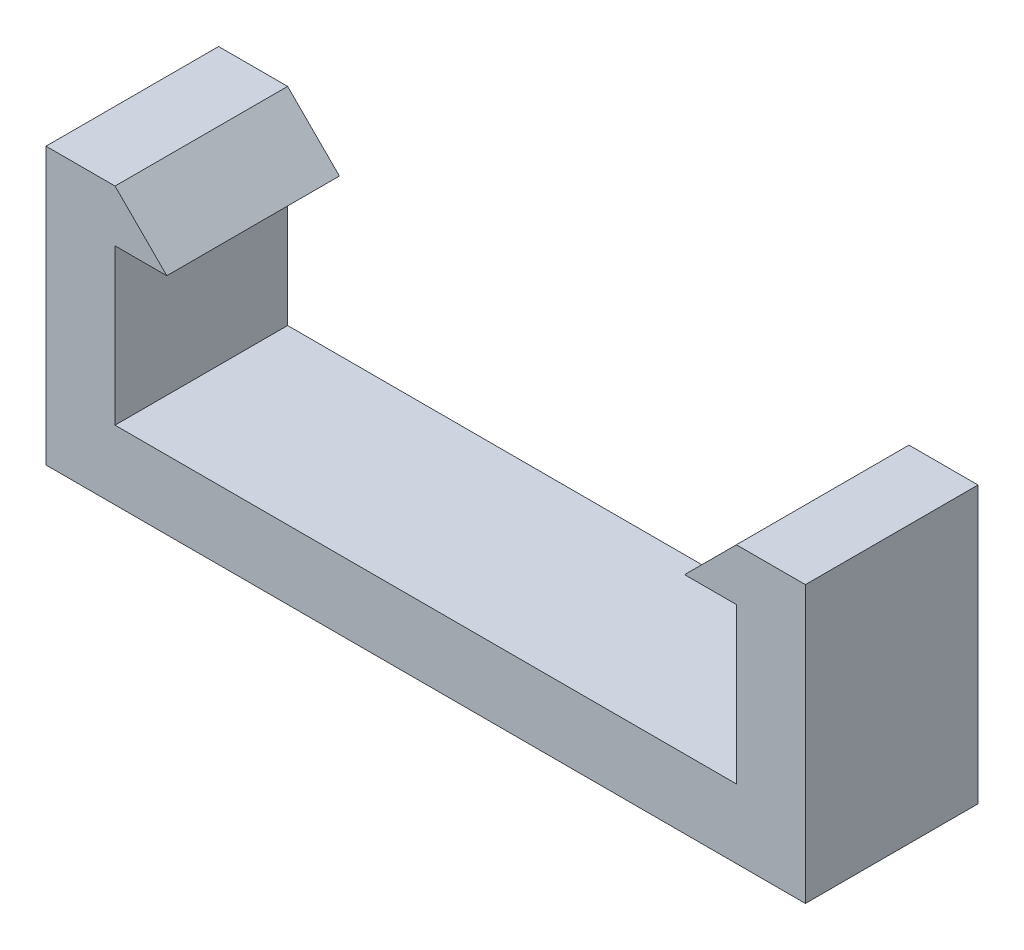
ISO-10303-21;
HEADER;
FILE_DESCRIPTION(('STEP AP214'),'2;1');
FILE_NAME('part.step','',(''),(''),'','','');
FILE_SCHEMA(('AUTOMOTIVE_DESIGN { 1 0 10303 214 1 1 1 1 }'));
ENDSEC;
DATA;
#1=APPLICATION_CONTEXT('core data for automotive mechanical design processes');
#2=APPLICATION_PROTOCOL_DEFINITION('international standard','automotive_design',2000,#1);
#3=PRODUCT_CONTEXT('',#1,'mechanical');
#4=PRODUCT('Part','Part','',(#3));
#5=PRODUCT_RELATED_PRODUCT_CATEGORY('part','',(#4));
#6=PRODUCT_DEFINITION_FORMATION('','',#4);
#7=PRODUCT_DEFINITION_CONTEXT('part definition',#1,'design');
#8=PRODUCT_DEFINITION('design','',#6,#7);
#9=PRODUCT_DEFINITION_SHAPE('','',#8);
#10=(LENGTH_UNIT() NAMED_UNIT(*) SI_UNIT(.MILLI.,.METRE.));
#11=(NAMED_UNIT(*) PLANE_ANGLE_UNIT() SI_UNIT($,.RADIAN.));
#12=(NAMED_UNIT(*) SI_UNIT($,.STERADIAN.) SOLID_ANGLE_UNIT());
#13=UNCERTAINTY_MEASURE_WITH_UNIT(LENGTH_MEASURE(1.E-05),#10,'distance_accuracy_value','');
#14=(GEOMETRIC_REPRESENTATION_CONTEXT(3) GLOBAL_UNCERTAINTY_ASSIGNED_CONTEXT((#13)) GLOBAL_UNIT_ASSIGNED_CONTEXT((#10,
#11,#12)) REPRESENTATION_CONTEXT('',''));
#15=CARTESIAN_POINT('',(0.,0.,0.));
#16=DIRECTION('',(0.,0.,1.));
#17=DIRECTION('',(1.,0.,0.));
#18=AXIS2_PLACEMENT_3D('',#15,#16,#17);
#19=CARTESIAN_POINT('',(2.,0.,5.));
#20=DIRECTION('',(0.,-1.,0.));
#21=DIRECTION('',(1.,0.,0.));
#22=AXIS2_PLACEMENT_3D('',#19,#20,#21);
#23=PLANE('',#22);
#24=DIRECTION('',(-1.,0.,0.));
#25=VECTOR('',#24,1.);
#26=CARTESIAN_POINT('',(2.,0.,0.));
#27=LINE('',#26,#25);
#28=CARTESIAN_POINT('',(2.,0.,0.));
#29=VERTEX_POINT('',#28);
#30=CARTESIAN_POINT('',(0.,0.,0.));
#31=VERTEX_POINT('',#30);
#32=EDGE_CURVE('E153',#29,#31,#27,.T.);
#33=ORIENTED_EDGE('',*,*,#32,.T.);
#34=DIRECTION('',(0.,0.,-1.));
#35=VECTOR('',#34,1.);
#36=CARTESIAN_POINT('',(0.,0.,5.));
#37=LINE('',#36,#35);
#38=CARTESIAN_POINT('',(0.,0.,5.));
#39=VERTEX_POINT('',#38);
#40=EDGE_CURVE('E11',#39,#31,#37,.T.);
#41=ORIENTED_EDGE('',*,*,#40,.F.);
#42=DIRECTION('',(-1.,0.,0.));
#43=VECTOR('',#42,1.);
#44=CARTESIAN_POINT('',(2.,0.,5.));
#45=LINE('',#44,#43);
#46=CARTESIAN_POINT('',(2.,0.,5.));
#47=VERTEX_POINT('',#46);
#48=EDGE_CURVE('E175',#47,#39,#45,.T.);
#49=ORIENTED_EDGE('',*,*,#48,.F.);
#50=DIRECTION('',(0.,0.,-1.));
#51=VECTOR('',#50,1.);
#52=CARTESIAN_POINT('',(2.,0.,5.));
#53=LINE('',#52,#51);
#54=EDGE_CURVE('E149',#47,#29,#53,.T.);
#55=ORIENTED_EDGE('',*,*,#54,.T.);
#56=EDGE_LOOP('',(#33,#41,#49,#55));
#57=FACE_BOUND('',#56,.T.);
#58=ADVANCED_FACE('F33',(#57),#23,.F.);
#59=CARTESIAN_POINT('',(0.,0.,5.));
#60=DIRECTION('',(1.,0.,0.));
#61=DIRECTION('',(0.,1.,0.));
#62=AXIS2_PLACEMENT_3D('',#59,#60,#61);
#63=PLANE('',#62);
#64=DIRECTION('',(0.,-1.,0.));
#65=VECTOR('',#64,1.);
#66=CARTESIAN_POINT('',(0.,0.,0.));
#67=LINE('',#66,#65);
#68=CARTESIAN_POINT('',(0.,-8.,0.));
#69=VERTEX_POINT('',#68);
#70=EDGE_CURVE('E156',#31,#69,#67,.T.);
#71=ORIENTED_EDGE('',*,*,#70,.T.);
#72=DIRECTION('',(0.,0.,-1.));
#73=VECTOR('',#72,1.);
#74=CARTESIAN_POINT('',(0.,-8.,5.));
#75=LINE('',#74,#73);
#76=CARTESIAN_POINT('',(0.,-8.,5.));
#77=VERTEX_POINT('',#76);
#78=EDGE_CURVE('E41',#77,#69,#75,.T.);
#79=ORIENTED_EDGE('',*,*,#78,.F.);
#80=DIRECTION('',(0.,-1.,0.));
#81=VECTOR('',#80,1.);
#82=CARTESIAN_POINT('',(0.,0.,5.));
#83=LINE('',#82,#81);
#84=EDGE_CURVE('E104',#39,#77,#83,.T.);
#85=ORIENTED_EDGE('',*,*,#84,.F.);
#86=ORIENTED_EDGE('',*,*,#40,.T.);
#87=EDGE_LOOP('',(#71,#79,#85,#86));
#88=FACE_BOUND('',#87,.T.);
#89=ADVANCED_FACE('F253',(#88),#63,.F.);
#90=CARTESIAN_POINT('',(0.,-8.,5.));
#91=DIRECTION('',(0.,1.,0.));
#92=DIRECTION('',(0.,0.,1.));
#93=AXIS2_PLACEMENT_3D('',#90,#91,#92);
#94=PLANE('',#93);
#95=DIRECTION('',(1.,0.,0.));
#96=VECTOR('',#95,1.);
#97=CARTESIAN_POINT('',(0.,-8.,0.));
#98=LINE('',#97,#96);
#99=CARTESIAN_POINT('',(22.,-8.,0.));
#100=VERTEX_POINT('',#99);
#101=EDGE_CURVE('E158',#69,#100,#98,.T.);
#102=ORIENTED_EDGE('',*,*,#101,.T.);
#103=DIRECTION('',(0.,0.,-1.));
#104=VECTOR('',#103,1.);
#105=CARTESIAN_POINT('',(22.,-8.,5.));
#106=LINE('',#105,#104);
#107=CARTESIAN_POINT('',(22.,-8.,5.));
#108=VERTEX_POINT('',#107);
#109=EDGE_CURVE('E194',#108,#100,#106,.T.);
#110=ORIENTED_EDGE('',*,*,#109,.F.);
#111=DIRECTION('',(1.,0.,0.));
#112=VECTOR('',#111,1.);
#113=CARTESIAN_POINT('',(0.,-8.,5.));
#114=LINE('',#113,#112);
#115=EDGE_CURVE('E202',#77,#108,#114,.T.);
#116=ORIENTED_EDGE('',*,*,#115,.F.);
#117=ORIENTED_EDGE('',*,*,#78,.T.);
#118=EDGE_LOOP('',(#102,#110,#116,#117));
#119=FACE_BOUND('',#118,.T.);
#120=ADVANCED_FACE('F200',(#119),#94,.F.);
#121=CARTESIAN_POINT('',(22.,-8.,5.));
#122=DIRECTION('',(-1.,0.,0.));
#123=DIRECTION('',(0.,-1.,0.));
#124=AXIS2_PLACEMENT_3D('',#121,#122,#123);
#125=PLANE('',#124);
#126=DIRECTION('',(0.,1.,0.));
#127=VECTOR('',#126,1.);
#128=CARTESIAN_POINT('',(22.,-8.,0.));
#129=LINE('',#128,#127);
#130=CARTESIAN_POINT('',(22.,0.,0.));
#131=VERTEX_POINT('',#130);
#132=EDGE_CURVE('E160',#100,#131,#129,.T.);
#133=ORIENTED_EDGE('',*,*,#132,.T.);
#134=DIRECTION('',(0.,0.,-1.));
#135=VECTOR('',#134,1.);
#136=CARTESIAN_POINT('',(22.,0.,5.));
#137=LINE('',#136,#135);
#138=CARTESIAN_POINT('',(22.,0.,5.));
#139=VERTEX_POINT('',#138);
#140=EDGE_CURVE('E191',#139,#131,#137,.T.);
#141=ORIENTED_EDGE('',*,*,#140,.F.);
#142=DIRECTION('',(0.,1.,0.));
#143=VECTOR('',#142,1.);
#144=CARTESIAN_POINT('',(22.,-8.,5.));
#145=LINE('',#144,#143);
#146=EDGE_CURVE('E220',#108,#139,#145,.T.);
#147=ORIENTED_EDGE('',*,*,#146,.F.);
#148=ORIENTED_EDGE('',*,*,#109,.T.);
#149=EDGE_LOOP('',(#133,#141,#147,#148));
#150=FACE_BOUND('',#149,.T.);
#151=ADVANCED_FACE('F211',(#150),#125,.F.);
#152=CARTESIAN_POINT('',(22.,0.,5.));
#153=DIRECTION('',(0.,-1.,0.));
#154=DIRECTION('',(1.,0.,0.));
#155=AXIS2_PLACEMENT_3D('',#152,#153,#154);
#156=PLANE('',#155);
#157=DIRECTION('',(-1.,0.,0.));
#158=VECTOR('',#157,1.);
#159=CARTESIAN_POINT('',(22.,0.,0.));
#160=LINE('',#159,#158);
#161=CARTESIAN_POINT('',(20.,0.,0.));
#162=VERTEX_POINT('',#161);
#163=EDGE_CURVE('E162',#131,#162,#160,.T.);
#164=ORIENTED_EDGE('',*,*,#163,.T.);
#165=DIRECTION('',(0.,0.,-1.));
#166=VECTOR('',#165,1.);
#167=CARTESIAN_POINT('',(20.,0.,5.));
#168=LINE('',#167,#166);
#169=CARTESIAN_POINT('',(20.,0.,5.));
#170=VERTEX_POINT('',#169);
#171=EDGE_CURVE('E188',#170,#162,#168,.T.);
#172=ORIENTED_EDGE('',*,*,#171,.F.);
#173=DIRECTION('',(-1.,0.,0.));
#174=VECTOR('',#173,1.);
#175=CARTESIAN_POINT('',(22.,0.,5.));
#176=LINE('',#175,#174);
#177=EDGE_CURVE('E217',#139,#170,#176,.T.);
#178=ORIENTED_EDGE('',*,*,#177,.F.);
#179=ORIENTED_EDGE('',*,*,#140,.T.);
#180=EDGE_LOOP('',(#164,#172,#178,#179));
#181=FACE_BOUND('',#180,.T.);
#182=ADVANCED_FACE('F215',(#181),#156,.F.);
#183=CARTESIAN_POINT('',(18.5,-1.5,5.));
#184=DIRECTION('',(0.707106781186548,-0.707106781186547,0.));
#185=DIRECTION('',(0.707106781186547,0.707106781186548,0.));
#186=AXIS2_PLACEMENT_3D('',#183,#184,#185);
#187=PLANE('',#186);
#188=DIRECTION('',(-0.707106781186547,-0.707106781186548,0.));
#189=VECTOR('',#188,1.);
#190=CARTESIAN_POINT('',(18.5,-1.5,0.));
#191=LINE('',#190,#189);
#192=CARTESIAN_POINT('',(18.5,-1.5,0.));
#193=VERTEX_POINT('',#192);
#194=EDGE_CURVE('E164',#162,#193,#191,.T.);
#195=ORIENTED_EDGE('',*,*,#194,.T.);
#196=DIRECTION('',(0.,0.,-1.));
#197=VECTOR('',#196,1.);
#198=CARTESIAN_POINT('',(18.5,-1.5,5.));
#199=LINE('',#198,#197);
#200=CARTESIAN_POINT('',(18.5,-1.5,5.));
#201=VERTEX_POINT('',#200);
#202=EDGE_CURVE('E185',#201,#193,#199,.T.);
#203=ORIENTED_EDGE('',*,*,#202,.F.);
#204=DIRECTION('',(-0.707106781186547,-0.707106781186548,0.));
#205=VECTOR('',#204,1.);
#206=CARTESIAN_POINT('',(18.5,-1.5,5.));
#207=LINE('',#206,#205);
#208=EDGE_CURVE('E219',#170,#201,#207,.T.);
#209=ORIENTED_EDGE('',*,*,#208,.F.);
#210=ORIENTED_EDGE('',*,*,#171,.T.);
#211=EDGE_LOOP('',(#195,#203,#209,#210));
#212=FACE_BOUND('',#211,.T.);
#213=ADVANCED_FACE('F266',(#212),#187,.F.);
#214=CARTESIAN_POINT('',(20.,-1.5,5.));
#215=DIRECTION('',(0.,1.,0.));
#216=DIRECTION('',(-1.,0.,0.));
#217=AXIS2_PLACEMENT_3D('',#214,#215,#216);
#218=PLANE('',#217);
#219=DIRECTION('',(1.,0.,0.));
#220=VECTOR('',#219,1.);
#221=CARTESIAN_POINT('',(20.,-1.5,0.));
#222=LINE('',#221,#220);
#223=CARTESIAN_POINT('',(20.,-1.5,0.));
#224=VERTEX_POINT('',#223);
#225=EDGE_CURVE('E166',#193,#224,#222,.T.);
#226=ORIENTED_EDGE('',*,*,#225,.T.);
#227=DIRECTION('',(0.,0.,-1.));
#228=VECTOR('',#227,1.);
#229=CARTESIAN_POINT('',(20.,-1.5,5.));
#230=LINE('',#229,#228);
#231=CARTESIAN_POINT('',(20.,-1.5,5.));
#232=VERTEX_POINT('',#231);
#233=EDGE_CURVE('E182',#232,#224,#230,.T.);
#234=ORIENTED_EDGE('',*,*,#233,.F.);
#235=DIRECTION('',(1.,0.,0.));
#236=VECTOR('',#235,1.);
#237=CARTESIAN_POINT('',(20.,-1.5,5.));
#238=LINE('',#237,#236);
#239=EDGE_CURVE('E222',#201,#232,#238,.T.);
#240=ORIENTED_EDGE('',*,*,#239,.F.);
#241=ORIENTED_EDGE('',*,*,#202,.T.);
#242=EDGE_LOOP('',(#226,#234,#240,#241));
#243=FACE_BOUND('',#242,.T.);
#244=ADVANCED_FACE('F269',(#243),#218,.F.);
#245=CARTESIAN_POINT('',(20.,-1.5,5.));
#246=DIRECTION('',(1.,0.,0.));
#247=DIRECTION('',(0.,0.,-1.));
#248=AXIS2_PLACEMENT_3D('',#245,#246,#247);
#249=PLANE('',#248);
#250=DIRECTION('',(0.,-1.,0.));
#251=VECTOR('',#250,1.);
#252=CARTESIAN_POINT('',(20.,-1.5,0.));
#253=LINE('',#252,#251);
#254=CARTESIAN_POINT('',(20.,-6.,0.));
#255=VERTEX_POINT('',#254);
#256=EDGE_CURVE('E168',#224,#255,#253,.T.);
#257=ORIENTED_EDGE('',*,*,#256,.T.);
#258=DIRECTION('',(0.,0.,-1.));
#259=VECTOR('',#258,1.);
#260=CARTESIAN_POINT('',(20.,-6.,5.));
#261=LINE('',#260,#259);
#262=CARTESIAN_POINT('',(20.,-6.,5.));
#263=VERTEX_POINT('',#262);
#264=EDGE_CURVE('E179',#263,#255,#261,.T.);
#265=ORIENTED_EDGE('',*,*,#264,.F.);
#266=DIRECTION('',(0.,-1.,0.));
#267=VECTOR('',#266,1.);
#268=CARTESIAN_POINT('',(20.,-1.5,5.));
#269=LINE('',#268,#267);
#270=EDGE_CURVE('E228',#232,#263,#269,.T.);
#271=ORIENTED_EDGE('',*,*,#270,.F.);
#272=ORIENTED_EDGE('',*,*,#233,.T.);
#273=EDGE_LOOP('',(#257,#265,#271,#272));
#274=FACE_BOUND('',#273,.T.);
#275=ADVANCED_FACE('F234',(#274),#249,.F.);
#276=CARTESIAN_POINT('',(20.,-6.,5.));
#277=DIRECTION('',(0.,-1.,0.));
#278=DIRECTION('',(1.,0.,0.));
#279=AXIS2_PLACEMENT_3D('',#276,#277,#278);
#280=PLANE('',#279);
#281=DIRECTION('',(-1.,0.,0.));
#282=VECTOR('',#281,1.);
#283=CARTESIAN_POINT('',(20.,-6.,0.));
#284=LINE('',#283,#282);
#285=CARTESIAN_POINT('',(2.,-6.,0.));
#286=VERTEX_POINT('',#285);
#287=EDGE_CURVE('E170',#255,#286,#284,.T.);
#288=ORIENTED_EDGE('',*,*,#287,.T.);
#289=DIRECTION('',(0.,0.,-1.));
#290=VECTOR('',#289,1.);
#291=CARTESIAN_POINT('',(2.,-6.,5.));
#292=LINE('',#291,#290);
#293=CARTESIAN_POINT('',(2.,-6.,5.));
#294=VERTEX_POINT('',#293);
#295=EDGE_CURVE('E144',#294,#286,#292,.T.);
#296=ORIENTED_EDGE('',*,*,#295,.F.);
#297=DIRECTION('',(-1.,0.,0.));
#298=VECTOR('',#297,1.);
#299=CARTESIAN_POINT('',(20.,-6.,5.));
#300=LINE('',#299,#298);
#301=EDGE_CURVE('E135',#263,#294,#300,.T.);
#302=ORIENTED_EDGE('',*,*,#301,.F.);
#303=ORIENTED_EDGE('',*,*,#264,.T.);
#304=EDGE_LOOP('',(#288,#296,#302,#303));
#305=FACE_BOUND('',#304,.T.);
#306=ADVANCED_FACE('F238',(#305),#280,.F.);
#307=CARTESIAN_POINT('',(2.,-6.,5.));
#308=DIRECTION('',(-1.,0.,0.));
#309=DIRECTION('',(0.,-1.,0.));
#310=AXIS2_PLACEMENT_3D('',#307,#308,#309);
#311=PLANE('',#310);
#312=DIRECTION('',(0.,1.,0.));
#313=VECTOR('',#312,1.);
#314=CARTESIAN_POINT('',(2.,-6.,0.));
#315=LINE('',#314,#313);
#316=CARTESIAN_POINT('',(2.,-1.5,0.));
#317=VERTEX_POINT('',#316);
#318=EDGE_CURVE('E143',#286,#317,#315,.T.);
#319=ORIENTED_EDGE('',*,*,#318,.T.);
#320=DIRECTION('',(0.,0.,-1.));
#321=VECTOR('',#320,1.);
#322=CARTESIAN_POINT('',(2.,-1.5,5.));
#323=LINE('',#322,#321);
#324=CARTESIAN_POINT('',(2.,-1.5,5.));
#325=VERTEX_POINT('',#324);
#326=EDGE_CURVE('E140',#325,#317,#323,.T.);
#327=ORIENTED_EDGE('',*,*,#326,.F.);
#328=DIRECTION('',(0.,1.,0.));
#329=VECTOR('',#328,1.);
#330=CARTESIAN_POINT('',(2.,-6.,5.));
#331=LINE('',#330,#329);
#332=EDGE_CURVE('E129',#294,#325,#331,.T.);
#333=ORIENTED_EDGE('',*,*,#332,.F.);
#334=ORIENTED_EDGE('',*,*,#295,.T.);
#335=EDGE_LOOP('',(#319,#327,#333,#334));
#336=FACE_BOUND('',#335,.T.);
#337=ADVANCED_FACE('F141',(#336),#311,.F.);
#338=CARTESIAN_POINT('',(2.,-1.5,5.));
#339=DIRECTION('',(0.,1.,0.));
#340=DIRECTION('',(-1.,0.,0.));
#341=AXIS2_PLACEMENT_3D('',#338,#339,#340);
#342=PLANE('',#341);
#343=DIRECTION('',(1.,0.,0.));
#344=VECTOR('',#343,1.);
#345=CARTESIAN_POINT('',(2.,-1.5,0.));
#346=LINE('',#345,#344);
#347=CARTESIAN_POINT('',(3.5,-1.5,0.));
#348=VERTEX_POINT('',#347);
#349=EDGE_CURVE('E90',#317,#348,#346,.T.);
#350=ORIENTED_EDGE('',*,*,#349,.T.);
#351=DIRECTION('',(0.,0.,-1.));
#352=VECTOR('',#351,1.);
#353=CARTESIAN_POINT('',(3.5,-1.5,5.));
#354=LINE('',#353,#352);
#355=CARTESIAN_POINT('',(3.5,-1.5,5.));
#356=VERTEX_POINT('',#355);
#357=EDGE_CURVE('E145',#356,#348,#354,.T.);
#358=ORIENTED_EDGE('',*,*,#357,.F.);
#359=DIRECTION('',(1.,0.,0.));
#360=VECTOR('',#359,1.);
#361=CARTESIAN_POINT('',(2.,-1.5,5.));
#362=LINE('',#361,#360);
#363=EDGE_CURVE('E133',#325,#356,#362,.T.);
#364=ORIENTED_EDGE('',*,*,#363,.F.);
#365=ORIENTED_EDGE('',*,*,#326,.T.);
#366=EDGE_LOOP('',(#350,#358,#364,#365));
#367=FACE_BOUND('',#366,.T.);
#368=ADVANCED_FACE('F147',(#367),#342,.F.);
#369=CARTESIAN_POINT('',(3.5,-1.5,5.));
#370=DIRECTION('',(-0.707106781186547,-0.707106781186548,0.));
#371=DIRECTION('',(0.707106781186548,-0.707106781186547,0.));
#372=AXIS2_PLACEMENT_3D('',#369,#370,#371);
#373=PLANE('',#372);
#374=DIRECTION('',(-0.707106781186548,0.707106781186547,0.));
#375=VECTOR('',#374,1.);
#376=CARTESIAN_POINT('',(3.5,-1.5,0.));
#377=LINE('',#376,#375);
#378=EDGE_CURVE('E96',#348,#29,#377,.T.);
#379=ORIENTED_EDGE('',*,*,#378,.T.);
#380=ORIENTED_EDGE('',*,*,#54,.F.);
#381=DIRECTION('',(-0.707106781186548,0.707106781186547,0.));
#382=VECTOR('',#381,1.);
#383=CARTESIAN_POINT('',(3.5,-1.5,5.));
#384=LINE('',#383,#382);
#385=EDGE_CURVE('E49',#356,#47,#384,.T.);
#386=ORIENTED_EDGE('',*,*,#385,.F.);
#387=ORIENTED_EDGE('',*,*,#357,.T.);
#388=EDGE_LOOP('',(#379,#380,#386,#387));
#389=FACE_BOUND('',#388,.T.);
#390=ADVANCED_FACE('F242',(#389),#373,.F.);
#391=CARTESIAN_POINT('',(0.,0.,5.));
#392=DIRECTION('',(0.,0.,1.));
#393=DIRECTION('',(1.,0.,0.));
#394=AXIS2_PLACEMENT_3D('',#391,#392,#393);
#395=PLANE('',#394);
#396=ORIENTED_EDGE('',*,*,#48,.T.);
#397=ORIENTED_EDGE('',*,*,#84,.T.);
#398=ORIENTED_EDGE('',*,*,#115,.T.);
#399=ORIENTED_EDGE('',*,*,#146,.T.);
#400=ORIENTED_EDGE('',*,*,#177,.T.);
#401=ORIENTED_EDGE('',*,*,#208,.T.);
#402=ORIENTED_EDGE('',*,*,#239,.T.);
#403=ORIENTED_EDGE('',*,*,#270,.T.);
#404=ORIENTED_EDGE('',*,*,#301,.T.);
#405=ORIENTED_EDGE('',*,*,#332,.T.);
#406=ORIENTED_EDGE('',*,*,#363,.T.);
#407=ORIENTED_EDGE('',*,*,#385,.T.);
#408=EDGE_LOOP('',(#396,#397,#398,#399,#400,#401,#402,#403,#404,#405,#406,#407));
#409=FACE_BOUND('',#408,.T.);
#410=ADVANCED_FACE('F131',(#409),#395,.T.);
#411=CARTESIAN_POINT('',(0.,0.,0.));
#412=DIRECTION('',(0.,0.,1.));
#413=DIRECTION('',(1.,0.,0.));
#414=AXIS2_PLACEMENT_3D('',#411,#412,#413);
#415=PLANE('',#414);
#416=ORIENTED_EDGE('',*,*,#32,.F.);
#417=ORIENTED_EDGE('',*,*,#378,.F.);
#418=ORIENTED_EDGE('',*,*,#349,.F.);
#419=ORIENTED_EDGE('',*,*,#318,.F.);
#420=ORIENTED_EDGE('',*,*,#287,.F.);
#421=ORIENTED_EDGE('',*,*,#256,.F.);
#422=ORIENTED_EDGE('',*,*,#225,.F.);
#423=ORIENTED_EDGE('',*,*,#194,.F.);
#424=ORIENTED_EDGE('',*,*,#163,.F.);
#425=ORIENTED_EDGE('',*,*,#132,.F.);
#426=ORIENTED_EDGE('',*,*,#101,.F.);
#427=ORIENTED_EDGE('',*,*,#70,.F.);
#428=EDGE_LOOP('',(#416,#417,#418,#419,#420,#421,#422,#423,#424,#425,#426,#427));
#429=FACE_BOUND('',#428,.T.);
#430=ADVANCED_FACE('F206',(#429),#415,.F.);
#431=CLOSED_SHELL('',(#58,#89,#120,#151,#182,#213,#244,#275,#306,#337,#368,#390,#410,#430));
#432=MANIFOLD_SOLID_BREP('B2',#431);
#433=ADVANCED_BREP_SHAPE_REPRESENTATION('',(#18,#432),#14);
#434=SHAPE_DEFINITION_REPRESENTATION(#9,#433);
ENDSEC;
END-ISO-10303-21;
